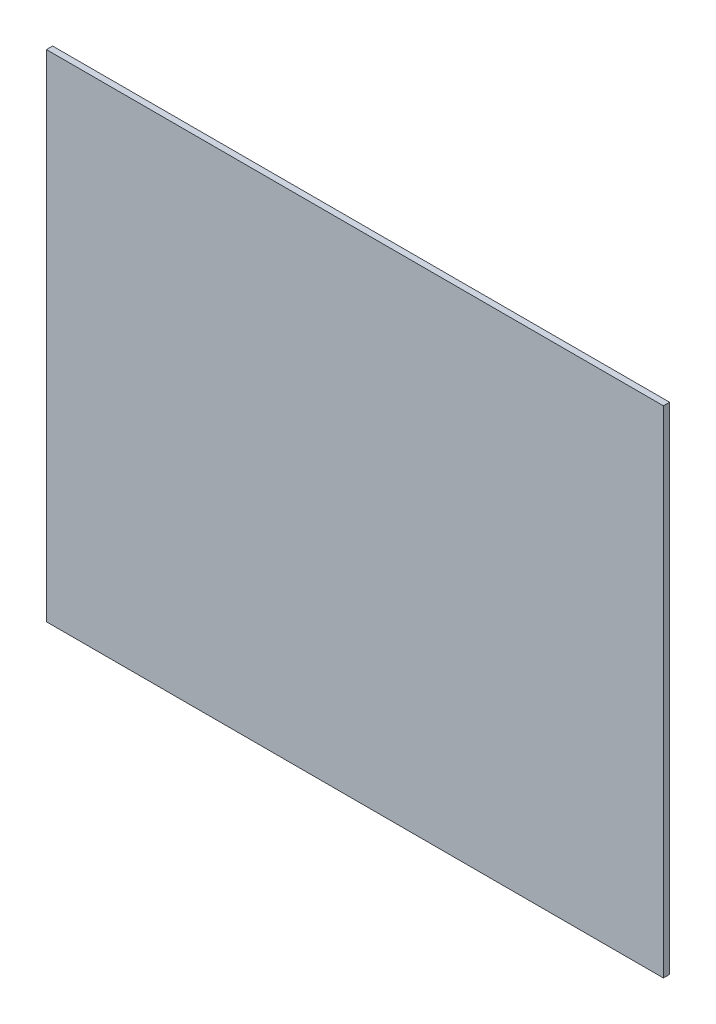
ISO-10303-21;
HEADER;
FILE_DESCRIPTION(('STEP AP214'),'2;1');
FILE_NAME('part.step','',(''),(''),'','','');
FILE_SCHEMA(('AUTOMOTIVE_DESIGN { 1 0 10303 214 1 1 1 1 }'));
ENDSEC;
DATA;
#1=APPLICATION_CONTEXT('core data for automotive mechanical design processes');
#2=APPLICATION_PROTOCOL_DEFINITION('international standard','automotive_design',2000,#1);
#3=PRODUCT_CONTEXT('',#1,'mechanical');
#4=PRODUCT('Part','Part','',(#3));
#5=PRODUCT_RELATED_PRODUCT_CATEGORY('part','',(#4));
#6=PRODUCT_DEFINITION_FORMATION('','',#4);
#7=PRODUCT_DEFINITION_CONTEXT('part definition',#1,'design');
#8=PRODUCT_DEFINITION('design','',#6,#7);
#9=PRODUCT_DEFINITION_SHAPE('','',#8);
#10=(LENGTH_UNIT() NAMED_UNIT(*) SI_UNIT(.MILLI.,.METRE.));
#11=(NAMED_UNIT(*) PLANE_ANGLE_UNIT() SI_UNIT($,.RADIAN.));
#12=(NAMED_UNIT(*) SI_UNIT($,.STERADIAN.) SOLID_ANGLE_UNIT());
#13=UNCERTAINTY_MEASURE_WITH_UNIT(LENGTH_MEASURE(1.E-05),#10,'distance_accuracy_value','');
#14=(GEOMETRIC_REPRESENTATION_CONTEXT(3) GLOBAL_UNCERTAINTY_ASSIGNED_CONTEXT((#13)) GLOBAL_UNIT_ASSIGNED_CONTEXT((#10,
#11,#12)) REPRESENTATION_CONTEXT('',''));
#15=CARTESIAN_POINT('',(0.,0.,0.));
#16=DIRECTION('',(0.,0.,1.));
#17=DIRECTION('',(1.,0.,0.));
#18=AXIS2_PLACEMENT_3D('',#15,#16,#17);
#19=CARTESIAN_POINT('',(-92.4429752066116,75.7768595041322,1.));
#20=DIRECTION('',(1.,0.,0.));
#21=DIRECTION('',(0.,1.,0.));
#22=AXIS2_PLACEMENT_3D('',#19,#20,#21);
#23=PLANE('',#22);
#24=DIRECTION('',(0.,-1.,0.));
#25=VECTOR('',#24,1.);
#26=CARTESIAN_POINT('',(-92.4429752066116,75.7768595041322,0.));
#27=LINE('',#26,#25);
#28=CARTESIAN_POINT('',(-92.4429752066116,75.7768595041322,0.));
#29=VERTEX_POINT('',#28);
#30=CARTESIAN_POINT('',(-92.4429752066116,-4.22314049586777,0.));
#31=VERTEX_POINT('',#30);
#32=EDGE_CURVE('E102',#29,#31,#27,.T.);
#33=ORIENTED_EDGE('',*,*,#32,.T.);
#34=DIRECTION('',(0.,0.,-1.));
#35=VECTOR('',#34,1.);
#36=CARTESIAN_POINT('',(-92.4429752066116,-4.22314049586777,1.));
#37=LINE('',#36,#35);
#38=CARTESIAN_POINT('',(-92.4429752066116,-4.22314049586777,1.));
#39=VERTEX_POINT('',#38);
#40=EDGE_CURVE('E11',#39,#31,#37,.T.);
#41=ORIENTED_EDGE('',*,*,#40,.F.);
#42=DIRECTION('',(0.,-1.,0.));
#43=VECTOR('',#42,1.);
#44=CARTESIAN_POINT('',(-92.4429752066116,75.7768595041322,1.));
#45=LINE('',#44,#43);
#46=CARTESIAN_POINT('',(-92.4429752066116,75.7768595041322,1.));
#47=VERTEX_POINT('',#46);
#48=EDGE_CURVE('E88',#47,#39,#45,.T.);
#49=ORIENTED_EDGE('',*,*,#48,.F.);
#50=DIRECTION('',(0.,0.,-1.));
#51=VECTOR('',#50,1.);
#52=CARTESIAN_POINT('',(-92.4429752066116,75.7768595041322,1.));
#53=LINE('',#52,#51);
#54=EDGE_CURVE('E55',#47,#29,#53,.T.);
#55=ORIENTED_EDGE('',*,*,#54,.T.);
#56=EDGE_LOOP('',(#33,#41,#49,#55));
#57=FACE_BOUND('',#56,.T.);
#58=ADVANCED_FACE('F39',(#57),#23,.F.);
#59=CARTESIAN_POINT('',(-92.4429752066116,-4.22314049586777,1.));
#60=DIRECTION('',(0.,1.,0.));
#61=DIRECTION('',(0.,0.,1.));
#62=AXIS2_PLACEMENT_3D('',#59,#60,#61);
#63=PLANE('',#62);
#64=DIRECTION('',(1.,0.,0.));
#65=VECTOR('',#64,1.);
#66=CARTESIAN_POINT('',(-92.4429752066116,-4.22314049586777,0.));
#67=LINE('',#66,#65);
#68=CARTESIAN_POINT('',(7.15702479338843,-4.22314049586777,0.));
#69=VERTEX_POINT('',#68);
#70=EDGE_CURVE('E93',#31,#69,#67,.T.);
#71=ORIENTED_EDGE('',*,*,#70,.T.);
#72=DIRECTION('',(0.,0.,-1.));
#73=VECTOR('',#72,1.);
#74=CARTESIAN_POINT('',(7.15702479338843,-4.22314049586777,1.));
#75=LINE('',#74,#73);
#76=CARTESIAN_POINT('',(7.15702479338843,-4.22314049586777,1.));
#77=VERTEX_POINT('',#76);
#78=EDGE_CURVE('E47',#77,#69,#75,.T.);
#79=ORIENTED_EDGE('',*,*,#78,.F.);
#80=DIRECTION('',(1.,0.,0.));
#81=VECTOR('',#80,1.);
#82=CARTESIAN_POINT('',(-92.4429752066116,-4.22314049586777,1.));
#83=LINE('',#82,#81);
#84=EDGE_CURVE('E80',#39,#77,#83,.T.);
#85=ORIENTED_EDGE('',*,*,#84,.F.);
#86=ORIENTED_EDGE('',*,*,#40,.T.);
#87=EDGE_LOOP('',(#71,#79,#85,#86));
#88=FACE_BOUND('',#87,.T.);
#89=ADVANCED_FACE('F92',(#88),#63,.F.);
#90=CARTESIAN_POINT('',(7.15702479338842,75.7768595041322,1.));
#91=DIRECTION('',(1.,0.,0.));
#92=DIRECTION('',(0.,1.,0.));
#93=AXIS2_PLACEMENT_3D('',#90,#91,#92);
#94=PLANE('',#93);
#95=DIRECTION('',(0.,-1.,0.));
#96=VECTOR('',#95,1.);
#97=CARTESIAN_POINT('',(7.15702479338842,75.7768595041322,0.));
#98=LINE('',#97,#96);
#99=CARTESIAN_POINT('',(7.15702479338842,75.7768595041322,0.));
#100=VERTEX_POINT('',#99);
#101=EDGE_CURVE('E105',#100,#69,#98,.T.);
#102=ORIENTED_EDGE('',*,*,#101,.F.);
#103=DIRECTION('',(0.,0.,-1.));
#104=VECTOR('',#103,1.);
#105=CARTESIAN_POINT('',(7.15702479338842,75.7768595041322,1.));
#106=LINE('',#105,#104);
#107=CARTESIAN_POINT('',(7.15702479338842,75.7768595041322,1.));
#108=VERTEX_POINT('',#107);
#109=EDGE_CURVE('E69',#108,#100,#106,.T.);
#110=ORIENTED_EDGE('',*,*,#109,.F.);
#111=DIRECTION('',(0.,-1.,0.));
#112=VECTOR('',#111,1.);
#113=CARTESIAN_POINT('',(7.15702479338842,75.7768595041322,1.));
#114=LINE('',#113,#112);
#115=EDGE_CURVE('E87',#108,#77,#114,.T.);
#116=ORIENTED_EDGE('',*,*,#115,.T.);
#117=ORIENTED_EDGE('',*,*,#78,.T.);
#118=EDGE_LOOP('',(#102,#110,#116,#117));
#119=FACE_BOUND('',#118,.T.);
#120=ADVANCED_FACE('F96',(#119),#94,.T.);
#121=CARTESIAN_POINT('',(-92.4429752066116,75.7768595041322,1.));
#122=DIRECTION('',(0.,1.,0.));
#123=DIRECTION('',(0.,0.,1.));
#124=AXIS2_PLACEMENT_3D('',#121,#122,#123);
#125=PLANE('',#124);
#126=DIRECTION('',(1.,0.,0.));
#127=VECTOR('',#126,1.);
#128=CARTESIAN_POINT('',(-92.4429752066116,75.7768595041322,0.));
#129=LINE('',#128,#127);
#130=EDGE_CURVE('E107',#29,#100,#129,.T.);
#131=ORIENTED_EDGE('',*,*,#130,.F.);
#132=ORIENTED_EDGE('',*,*,#54,.F.);
#133=DIRECTION('',(1.,0.,0.));
#134=VECTOR('',#133,1.);
#135=CARTESIAN_POINT('',(-92.4429752066116,75.7768595041322,1.));
#136=LINE('',#135,#134);
#137=EDGE_CURVE('E97',#47,#108,#136,.T.);
#138=ORIENTED_EDGE('',*,*,#137,.T.);
#139=ORIENTED_EDGE('',*,*,#109,.T.);
#140=EDGE_LOOP('',(#131,#132,#138,#139));
#141=FACE_BOUND('',#140,.T.);
#142=ADVANCED_FACE('F113',(#141),#125,.T.);
#143=CARTESIAN_POINT('',(0.,0.,1.));
#144=DIRECTION('',(0.,0.,1.));
#145=DIRECTION('',(1.,0.,0.));
#146=AXIS2_PLACEMENT_3D('',#143,#144,#145);
#147=PLANE('',#146);
#148=ORIENTED_EDGE('',*,*,#48,.T.);
#149=ORIENTED_EDGE('',*,*,#84,.T.);
#150=ORIENTED_EDGE('',*,*,#115,.F.);
#151=ORIENTED_EDGE('',*,*,#137,.F.);
#152=EDGE_LOOP('',(#148,#149,#150,#151));
#153=FACE_BOUND('',#152,.T.);
#154=ADVANCED_FACE('F84',(#153),#147,.T.);
#155=CARTESIAN_POINT('',(0.,0.,0.));
#156=DIRECTION('',(0.,0.,1.));
#157=DIRECTION('',(1.,0.,0.));
#158=AXIS2_PLACEMENT_3D('',#155,#156,#157);
#159=PLANE('',#158);
#160=ORIENTED_EDGE('',*,*,#32,.F.);
#161=ORIENTED_EDGE('',*,*,#130,.T.);
#162=ORIENTED_EDGE('',*,*,#101,.T.);
#163=ORIENTED_EDGE('',*,*,#70,.F.);
#164=EDGE_LOOP('',(#160,#161,#162,#163));
#165=FACE_BOUND('',#164,.T.);
#166=ADVANCED_FACE('F112',(#165),#159,.F.);
#167=CLOSED_SHELL('',(#58,#89,#120,#142,#154,#166));
#168=MANIFOLD_SOLID_BREP('B2',#167);
#169=ADVANCED_BREP_SHAPE_REPRESENTATION('',(#18,#168),#14);
#170=SHAPE_DEFINITION_REPRESENTATION(#9,#169);
ENDSEC;
END-ISO-10303-21;
